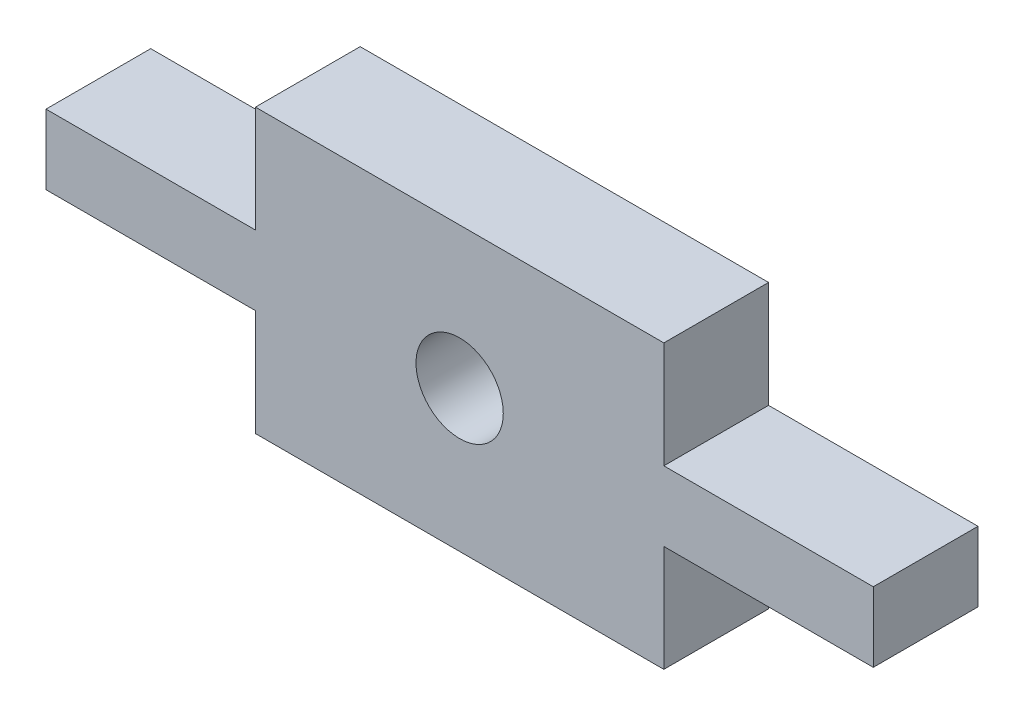
ISO-10303-21;
HEADER;
FILE_DESCRIPTION(('STEP AP214'),'2;1');
FILE_NAME('part.step','',(''),(''),'','','');
FILE_SCHEMA(('AUTOMOTIVE_DESIGN { 1 0 10303 214 1 1 1 1 }'));
ENDSEC;
DATA;
#1=APPLICATION_CONTEXT('core data for automotive mechanical design processes');
#2=APPLICATION_PROTOCOL_DEFINITION('international standard','automotive_design',2000,#1);
#3=PRODUCT_CONTEXT('',#1,'mechanical');
#4=PRODUCT('Part','Part','',(#3));
#5=PRODUCT_RELATED_PRODUCT_CATEGORY('part','',(#4));
#6=PRODUCT_DEFINITION_FORMATION('','',#4);
#7=PRODUCT_DEFINITION_CONTEXT('part definition',#1,'design');
#8=PRODUCT_DEFINITION('design','',#6,#7);
#9=PRODUCT_DEFINITION_SHAPE('','',#8);
#10=(LENGTH_UNIT() NAMED_UNIT(*) SI_UNIT(.MILLI.,.METRE.));
#11=(NAMED_UNIT(*) PLANE_ANGLE_UNIT() SI_UNIT($,.RADIAN.));
#12=(NAMED_UNIT(*) SI_UNIT($,.STERADIAN.) SOLID_ANGLE_UNIT());
#13=UNCERTAINTY_MEASURE_WITH_UNIT(LENGTH_MEASURE(1.E-05),#10,'distance_accuracy_value','');
#14=(GEOMETRIC_REPRESENTATION_CONTEXT(3) GLOBAL_UNCERTAINTY_ASSIGNED_CONTEXT((#13)) GLOBAL_UNIT_ASSIGNED_CONTEXT((#10,
#11,#12)) REPRESENTATION_CONTEXT('',''));
#15=CARTESIAN_POINT('',(0.,0.,0.));
#16=DIRECTION('',(0.,0.,1.));
#17=DIRECTION('',(1.,0.,0.));
#18=AXIS2_PLACEMENT_3D('',#15,#16,#17);
#19=CARTESIAN_POINT('',(0.,0.,3.));
#20=DIRECTION('',(0.,0.,-1.));
#21=DIRECTION('',(-1.,0.,0.));
#22=AXIS2_PLACEMENT_3D('',#19,#20,#21);
#23=PLANE('',#22);
#24=DIRECTION('',(1.,0.,0.));
#25=VECTOR('',#24,1.);
#26=CARTESIAN_POINT('',(-11.85,-1.,3.));
#27=LINE('',#26,#25);
#28=CARTESIAN_POINT('',(-11.85,-1.,3.));
#29=VERTEX_POINT('',#28);
#30=CARTESIAN_POINT('',(-5.85,-1.,3.));
#31=VERTEX_POINT('',#30);
#32=EDGE_CURVE('E176',#29,#31,#27,.T.);
#33=ORIENTED_EDGE('',*,*,#32,.T.);
#34=DIRECTION('',(0.,-1.,0.));
#35=VECTOR('',#34,1.);
#36=CARTESIAN_POINT('',(-5.85,-1.,3.));
#37=LINE('',#36,#35);
#38=CARTESIAN_POINT('',(-5.85,-4.05,3.));
#39=VERTEX_POINT('',#38);
#40=EDGE_CURVE('E104',#31,#39,#37,.T.);
#41=ORIENTED_EDGE('',*,*,#40,.T.);
#42=DIRECTION('',(1.,0.,0.));
#43=VECTOR('',#42,1.);
#44=CARTESIAN_POINT('',(-5.85,-4.05,3.));
#45=LINE('',#44,#43);
#46=CARTESIAN_POINT('',(5.85,-4.05,3.));
#47=VERTEX_POINT('',#46);
#48=EDGE_CURVE('E203',#39,#47,#45,.T.);
#49=ORIENTED_EDGE('',*,*,#48,.T.);
#50=DIRECTION('',(0.,1.,0.));
#51=VECTOR('',#50,1.);
#52=CARTESIAN_POINT('',(5.85,-4.05,3.));
#53=LINE('',#52,#51);
#54=CARTESIAN_POINT('',(5.85,-0.999999999999996,3.));
#55=VERTEX_POINT('',#54);
#56=EDGE_CURVE('E222',#47,#55,#53,.T.);
#57=ORIENTED_EDGE('',*,*,#56,.T.);
#58=DIRECTION('',(1.,0.,0.));
#59=VECTOR('',#58,1.);
#60=CARTESIAN_POINT('',(5.85,-0.999999999999996,3.));
#61=LINE('',#60,#59);
#62=CARTESIAN_POINT('',(11.85,-0.999999999999994,3.));
#63=VERTEX_POINT('',#62);
#64=EDGE_CURVE('E219',#55,#63,#61,.T.);
#65=ORIENTED_EDGE('',*,*,#64,.T.);
#66=DIRECTION('',(0.,1.,0.));
#67=VECTOR('',#66,1.);
#68=CARTESIAN_POINT('',(11.85,-0.999999999999994,3.));
#69=LINE('',#68,#67);
#70=CARTESIAN_POINT('',(11.85,1.00000000000001,3.));
#71=VERTEX_POINT('',#70);
#72=EDGE_CURVE('E221',#63,#71,#69,.T.);
#73=ORIENTED_EDGE('',*,*,#72,.T.);
#74=DIRECTION('',(-1.,0.,0.));
#75=VECTOR('',#74,1.);
#76=CARTESIAN_POINT('',(11.85,1.00000000000001,3.));
#77=LINE('',#76,#75);
#78=CARTESIAN_POINT('',(5.85,1.00000000000001,3.));
#79=VERTEX_POINT('',#78);
#80=EDGE_CURVE('E224',#71,#79,#77,.T.);
#81=ORIENTED_EDGE('',*,*,#80,.T.);
#82=DIRECTION('',(0.,1.,0.));
#83=VECTOR('',#82,1.);
#84=CARTESIAN_POINT('',(5.85,1.00000000000001,3.));
#85=LINE('',#84,#83);
#86=CARTESIAN_POINT('',(5.85,4.05000000000001,3.));
#87=VERTEX_POINT('',#86);
#88=EDGE_CURVE('E230',#79,#87,#85,.T.);
#89=ORIENTED_EDGE('',*,*,#88,.T.);
#90=DIRECTION('',(-1.,0.,0.));
#91=VECTOR('',#90,1.);
#92=CARTESIAN_POINT('',(5.85,4.05000000000001,3.));
#93=LINE('',#92,#91);
#94=CARTESIAN_POINT('',(-5.85,4.05,3.));
#95=VERTEX_POINT('',#94);
#96=EDGE_CURVE('E135',#87,#95,#93,.T.);
#97=ORIENTED_EDGE('',*,*,#96,.T.);
#98=DIRECTION('',(0.,-1.,0.));
#99=VECTOR('',#98,1.);
#100=CARTESIAN_POINT('',(-5.85,4.05,3.));
#101=LINE('',#100,#99);
#102=CARTESIAN_POINT('',(-5.85,0.999999999999998,3.));
#103=VERTEX_POINT('',#102);
#104=EDGE_CURVE('E129',#95,#103,#101,.T.);
#105=ORIENTED_EDGE('',*,*,#104,.T.);
#106=DIRECTION('',(-1.,0.,0.));
#107=VECTOR('',#106,1.);
#108=CARTESIAN_POINT('',(-5.85,0.999999999999998,3.));
#109=LINE('',#108,#107);
#110=CARTESIAN_POINT('',(-11.85,0.999999999999997,3.));
#111=VERTEX_POINT('',#110);
#112=EDGE_CURVE('E133',#103,#111,#109,.T.);
#113=ORIENTED_EDGE('',*,*,#112,.T.);
#114=DIRECTION('',(0.,-1.,0.));
#115=VECTOR('',#114,1.);
#116=CARTESIAN_POINT('',(-11.85,0.999999999999997,3.));
#117=LINE('',#116,#115);
#118=EDGE_CURVE('E49',#111,#29,#117,.T.);
#119=ORIENTED_EDGE('',*,*,#118,.T.);
#120=EDGE_LOOP('',(#33,#41,#49,#57,#65,#73,#81,#89,#97,#105,#113,#119));
#121=FACE_BOUND('',#120,.T.);
#122=CARTESIAN_POINT('',(0.,0.,3.));
#123=DIRECTION('',(0.,0.,1.));
#124=DIRECTION('',(1.,0.,0.));
#125=AXIS2_PLACEMENT_3D('',#122,#123,#124);
#126=CIRCLE('',#125,1.25);
#127=CARTESIAN_POINT('',(1.25,0.,3.));
#128=VERTEX_POINT('',#127);
#129=EDGE_CURVE('E157',#128,#128,#126,.T.);
#130=ORIENTED_EDGE('',*,*,#129,.F.);
#131=EDGE_LOOP('',(#130));
#132=FACE_BOUND('',#131,.T.);
#133=ADVANCED_FACE('F32',(#121,#132),#23,.F.);
#134=CARTESIAN_POINT('',(0.,0.,0.));
#135=DIRECTION('',(0.,0.,-1.));
#136=DIRECTION('',(-1.,0.,0.));
#137=AXIS2_PLACEMENT_3D('',#134,#135,#136);
#138=PLANE('',#137);
#139=DIRECTION('',(1.,0.,0.));
#140=VECTOR('',#139,1.);
#141=CARTESIAN_POINT('',(-11.85,-1.,0.));
#142=LINE('',#141,#140);
#143=CARTESIAN_POINT('',(-11.85,-1.,0.));
#144=VERTEX_POINT('',#143);
#145=CARTESIAN_POINT('',(-5.85,-1.,0.));
#146=VERTEX_POINT('',#145);
#147=EDGE_CURVE('E153',#144,#146,#142,.T.);
#148=ORIENTED_EDGE('',*,*,#147,.F.);
#149=DIRECTION('',(0.,-1.,0.));
#150=VECTOR('',#149,1.);
#151=CARTESIAN_POINT('',(-11.85,0.999999999999997,0.));
#152=LINE('',#151,#150);
#153=CARTESIAN_POINT('',(-11.85,0.999999999999997,0.));
#154=VERTEX_POINT('',#153);
#155=EDGE_CURVE('E96',#154,#144,#152,.T.);
#156=ORIENTED_EDGE('',*,*,#155,.F.);
#157=DIRECTION('',(-1.,0.,0.));
#158=VECTOR('',#157,1.);
#159=CARTESIAN_POINT('',(-5.85,0.999999999999998,0.));
#160=LINE('',#159,#158);
#161=CARTESIAN_POINT('',(-5.85,0.999999999999998,0.));
#162=VERTEX_POINT('',#161);
#163=EDGE_CURVE('E90',#162,#154,#160,.T.);
#164=ORIENTED_EDGE('',*,*,#163,.F.);
#165=DIRECTION('',(0.,-1.,0.));
#166=VECTOR('',#165,1.);
#167=CARTESIAN_POINT('',(-5.85,4.05,0.));
#168=LINE('',#167,#166);
#169=CARTESIAN_POINT('',(-5.85,4.05,0.));
#170=VERTEX_POINT('',#169);
#171=EDGE_CURVE('E143',#170,#162,#168,.T.);
#172=ORIENTED_EDGE('',*,*,#171,.F.);
#173=DIRECTION('',(-1.,0.,0.));
#174=VECTOR('',#173,1.);
#175=CARTESIAN_POINT('',(5.85,4.05000000000001,0.));
#176=LINE('',#175,#174);
#177=CARTESIAN_POINT('',(5.85,4.05000000000001,0.));
#178=VERTEX_POINT('',#177);
#179=EDGE_CURVE('E171',#178,#170,#176,.T.);
#180=ORIENTED_EDGE('',*,*,#179,.F.);
#181=DIRECTION('',(0.,1.,0.));
#182=VECTOR('',#181,1.);
#183=CARTESIAN_POINT('',(5.85,1.00000000000001,0.));
#184=LINE('',#183,#182);
#185=CARTESIAN_POINT('',(5.85,1.00000000000001,0.));
#186=VERTEX_POINT('',#185);
#187=EDGE_CURVE('E169',#186,#178,#184,.T.);
#188=ORIENTED_EDGE('',*,*,#187,.F.);
#189=DIRECTION('',(-1.,0.,0.));
#190=VECTOR('',#189,1.);
#191=CARTESIAN_POINT('',(11.85,1.00000000000001,0.));
#192=LINE('',#191,#190);
#193=CARTESIAN_POINT('',(11.85,1.00000000000001,0.));
#194=VERTEX_POINT('',#193);
#195=EDGE_CURVE('E167',#194,#186,#192,.T.);
#196=ORIENTED_EDGE('',*,*,#195,.F.);
#197=DIRECTION('',(0.,1.,0.));
#198=VECTOR('',#197,1.);
#199=CARTESIAN_POINT('',(11.85,-0.999999999999994,0.));
#200=LINE('',#199,#198);
#201=CARTESIAN_POINT('',(11.85,-0.999999999999994,0.));
#202=VERTEX_POINT('',#201);
#203=EDGE_CURVE('E165',#202,#194,#200,.T.);
#204=ORIENTED_EDGE('',*,*,#203,.F.);
#205=DIRECTION('',(1.,0.,0.));
#206=VECTOR('',#205,1.);
#207=CARTESIAN_POINT('',(5.85,-0.999999999999996,0.));
#208=LINE('',#207,#206);
#209=CARTESIAN_POINT('',(5.85,-0.999999999999996,0.));
#210=VERTEX_POINT('',#209);
#211=EDGE_CURVE('E163',#210,#202,#208,.T.);
#212=ORIENTED_EDGE('',*,*,#211,.F.);
#213=DIRECTION('',(0.,1.,0.));
#214=VECTOR('',#213,1.);
#215=CARTESIAN_POINT('',(5.85,-4.05,0.));
#216=LINE('',#215,#214);
#217=CARTESIAN_POINT('',(5.85,-4.05,0.));
#218=VERTEX_POINT('',#217);
#219=EDGE_CURVE('E161',#218,#210,#216,.T.);
#220=ORIENTED_EDGE('',*,*,#219,.F.);
#221=DIRECTION('',(1.,0.,0.));
#222=VECTOR('',#221,1.);
#223=CARTESIAN_POINT('',(-5.85,-4.05,0.));
#224=LINE('',#223,#222);
#225=CARTESIAN_POINT('',(-5.85,-4.05,0.));
#226=VERTEX_POINT('',#225);
#227=EDGE_CURVE('E159',#226,#218,#224,.T.);
#228=ORIENTED_EDGE('',*,*,#227,.F.);
#229=DIRECTION('',(0.,-1.,0.));
#230=VECTOR('',#229,1.);
#231=CARTESIAN_POINT('',(-5.85,-1.,0.));
#232=LINE('',#231,#230);
#233=EDGE_CURVE('E156',#146,#226,#232,.T.);
#234=ORIENTED_EDGE('',*,*,#233,.F.);
#235=EDGE_LOOP('',(#148,#156,#164,#172,#180,#188,#196,#204,#212,#220,#228,#234));
#236=FACE_BOUND('',#235,.T.);
#237=CARTESIAN_POINT('',(0.,0.,0.));
#238=DIRECTION('',(0.,0.,1.));
#239=DIRECTION('',(1.,0.,0.));
#240=AXIS2_PLACEMENT_3D('',#237,#238,#239);
#241=CIRCLE('',#240,1.25);
#242=CARTESIAN_POINT('',(1.25,0.,0.));
#243=VERTEX_POINT('',#242);
#244=EDGE_CURVE('E377',#243,#243,#241,.T.);
#245=ORIENTED_EDGE('',*,*,#244,.T.);
#246=EDGE_LOOP('',(#245));
#247=FACE_BOUND('',#246,.T.);
#248=ADVANCED_FACE('F207',(#236,#247),#138,.T.);
#249=CARTESIAN_POINT('',(-11.85,-1.,3.));
#250=DIRECTION('',(0.,1.,0.));
#251=DIRECTION('',(-1.,0.,0.));
#252=AXIS2_PLACEMENT_3D('',#249,#250,#251);
#253=PLANE('',#252);
#254=ORIENTED_EDGE('',*,*,#147,.T.);
#255=DIRECTION('',(0.,0.,-1.));
#256=VECTOR('',#255,1.);
#257=CARTESIAN_POINT('',(-5.85,-1.,3.));
#258=LINE('',#257,#256);
#259=EDGE_CURVE('E11',#31,#146,#258,.T.);
#260=ORIENTED_EDGE('',*,*,#259,.F.);
#261=ORIENTED_EDGE('',*,*,#32,.F.);
#262=DIRECTION('',(0.,0.,-1.));
#263=VECTOR('',#262,1.);
#264=CARTESIAN_POINT('',(-11.85,-1.,3.));
#265=LINE('',#264,#263);
#266=EDGE_CURVE('E149',#29,#144,#265,.T.);
#267=ORIENTED_EDGE('',*,*,#266,.T.);
#268=EDGE_LOOP('',(#254,#260,#261,#267));
#269=FACE_BOUND('',#268,.T.);
#270=ADVANCED_FACE('F34',(#269),#253,.F.);
#271=CARTESIAN_POINT('',(-5.85,-1.,3.));
#272=DIRECTION('',(1.,0.,0.));
#273=DIRECTION('',(0.,1.,0.));
#274=AXIS2_PLACEMENT_3D('',#271,#272,#273);
#275=PLANE('',#274);
#276=ORIENTED_EDGE('',*,*,#233,.T.);
#277=DIRECTION('',(0.,0.,-1.));
#278=VECTOR('',#277,1.);
#279=CARTESIAN_POINT('',(-5.85,-4.05,3.));
#280=LINE('',#279,#278);
#281=EDGE_CURVE('E41',#39,#226,#280,.T.);
#282=ORIENTED_EDGE('',*,*,#281,.F.);
#283=ORIENTED_EDGE('',*,*,#40,.F.);
#284=ORIENTED_EDGE('',*,*,#259,.T.);
#285=EDGE_LOOP('',(#276,#282,#283,#284));
#286=FACE_BOUND('',#285,.T.);
#287=ADVANCED_FACE('F264',(#286),#275,.F.);
#288=CARTESIAN_POINT('',(-5.85,-4.05,3.));
#289=DIRECTION('',(0.,1.,0.));
#290=DIRECTION('',(-1.,0.,0.));
#291=AXIS2_PLACEMENT_3D('',#288,#289,#290);
#292=PLANE('',#291);
#293=ORIENTED_EDGE('',*,*,#227,.T.);
#294=DIRECTION('',(0.,0.,-1.));
#295=VECTOR('',#294,1.);
#296=CARTESIAN_POINT('',(5.85,-4.05,3.));
#297=LINE('',#296,#295);
#298=EDGE_CURVE('E195',#47,#218,#297,.T.);
#299=ORIENTED_EDGE('',*,*,#298,.F.);
#300=ORIENTED_EDGE('',*,*,#48,.F.);
#301=ORIENTED_EDGE('',*,*,#281,.T.);
#302=EDGE_LOOP('',(#293,#299,#300,#301));
#303=FACE_BOUND('',#302,.T.);
#304=ADVANCED_FACE('F201',(#303),#292,.F.);
#305=CARTESIAN_POINT('',(5.85,-4.05,3.));
#306=DIRECTION('',(-1.,0.,0.));
#307=DIRECTION('',(0.,-1.,0.));
#308=AXIS2_PLACEMENT_3D('',#305,#306,#307);
#309=PLANE('',#308);
#310=ORIENTED_EDGE('',*,*,#219,.T.);
#311=DIRECTION('',(0.,0.,-1.));
#312=VECTOR('',#311,1.);
#313=CARTESIAN_POINT('',(5.85,-0.999999999999996,3.));
#314=LINE('',#313,#312);
#315=EDGE_CURVE('E192',#55,#210,#314,.T.);
#316=ORIENTED_EDGE('',*,*,#315,.F.);
#317=ORIENTED_EDGE('',*,*,#56,.F.);
#318=ORIENTED_EDGE('',*,*,#298,.T.);
#319=EDGE_LOOP('',(#310,#316,#317,#318));
#320=FACE_BOUND('',#319,.T.);
#321=ADVANCED_FACE('F213',(#320),#309,.F.);
#322=CARTESIAN_POINT('',(5.85,-0.999999999999996,3.));
#323=DIRECTION('',(0.,1.,0.));
#324=DIRECTION('',(-1.,0.,0.));
#325=AXIS2_PLACEMENT_3D('',#322,#323,#324);
#326=PLANE('',#325);
#327=ORIENTED_EDGE('',*,*,#211,.T.);
#328=DIRECTION('',(0.,0.,-1.));
#329=VECTOR('',#328,1.);
#330=CARTESIAN_POINT('',(11.85,-0.999999999999994,3.));
#331=LINE('',#330,#329);
#332=EDGE_CURVE('E189',#63,#202,#331,.T.);
#333=ORIENTED_EDGE('',*,*,#332,.F.);
#334=ORIENTED_EDGE('',*,*,#64,.F.);
#335=ORIENTED_EDGE('',*,*,#315,.T.);
#336=EDGE_LOOP('',(#327,#333,#334,#335));
#337=FACE_BOUND('',#336,.T.);
#338=ADVANCED_FACE('F217',(#337),#326,.F.);
#339=CARTESIAN_POINT('',(11.85,-0.999999999999994,3.));
#340=DIRECTION('',(-1.,0.,0.));
#341=DIRECTION('',(0.,-1.,0.));
#342=AXIS2_PLACEMENT_3D('',#339,#340,#341);
#343=PLANE('',#342);
#344=ORIENTED_EDGE('',*,*,#203,.T.);
#345=DIRECTION('',(0.,0.,-1.));
#346=VECTOR('',#345,1.);
#347=CARTESIAN_POINT('',(11.85,1.00000000000001,3.));
#348=LINE('',#347,#346);
#349=EDGE_CURVE('E186',#71,#194,#348,.T.);
#350=ORIENTED_EDGE('',*,*,#349,.F.);
#351=ORIENTED_EDGE('',*,*,#72,.F.);
#352=ORIENTED_EDGE('',*,*,#332,.T.);
#353=EDGE_LOOP('',(#344,#350,#351,#352));
#354=FACE_BOUND('',#353,.T.);
#355=ADVANCED_FACE('F277',(#354),#343,.F.);
#356=CARTESIAN_POINT('',(11.85,1.00000000000001,3.));
#357=DIRECTION('',(0.,-1.,0.));
#358=DIRECTION('',(0.,0.,-1.));
#359=AXIS2_PLACEMENT_3D('',#356,#357,#358);
#360=PLANE('',#359);
#361=ORIENTED_EDGE('',*,*,#195,.T.);
#362=DIRECTION('',(0.,0.,-1.));
#363=VECTOR('',#362,1.);
#364=CARTESIAN_POINT('',(5.85,1.00000000000001,3.));
#365=LINE('',#364,#363);
#366=EDGE_CURVE('E183',#79,#186,#365,.T.);
#367=ORIENTED_EDGE('',*,*,#366,.F.);
#368=ORIENTED_EDGE('',*,*,#80,.F.);
#369=ORIENTED_EDGE('',*,*,#349,.T.);
#370=EDGE_LOOP('',(#361,#367,#368,#369));
#371=FACE_BOUND('',#370,.T.);
#372=ADVANCED_FACE('F280',(#371),#360,.F.);
#373=CARTESIAN_POINT('',(5.85,1.00000000000001,3.));
#374=DIRECTION('',(-1.,0.,0.));
#375=DIRECTION('',(0.,0.,1.));
#376=AXIS2_PLACEMENT_3D('',#373,#374,#375);
#377=PLANE('',#376);
#378=ORIENTED_EDGE('',*,*,#187,.T.);
#379=DIRECTION('',(0.,0.,-1.));
#380=VECTOR('',#379,1.);
#381=CARTESIAN_POINT('',(5.85,4.05000000000001,3.));
#382=LINE('',#381,#380);
#383=EDGE_CURVE('E180',#87,#178,#382,.T.);
#384=ORIENTED_EDGE('',*,*,#383,.F.);
#385=ORIENTED_EDGE('',*,*,#88,.F.);
#386=ORIENTED_EDGE('',*,*,#366,.T.);
#387=EDGE_LOOP('',(#378,#384,#385,#386));
#388=FACE_BOUND('',#387,.T.);
#389=ADVANCED_FACE('F236',(#388),#377,.F.);
#390=CARTESIAN_POINT('',(5.85,4.05000000000001,3.));
#391=DIRECTION('',(0.,-1.,0.));
#392=DIRECTION('',(1.,0.,0.));
#393=AXIS2_PLACEMENT_3D('',#390,#391,#392);
#394=PLANE('',#393);
#395=ORIENTED_EDGE('',*,*,#179,.T.);
#396=DIRECTION('',(0.,0.,-1.));
#397=VECTOR('',#396,1.);
#398=CARTESIAN_POINT('',(-5.85,4.05,3.));
#399=LINE('',#398,#397);
#400=EDGE_CURVE('E144',#95,#170,#399,.T.);
#401=ORIENTED_EDGE('',*,*,#400,.F.);
#402=ORIENTED_EDGE('',*,*,#96,.F.);
#403=ORIENTED_EDGE('',*,*,#383,.T.);
#404=EDGE_LOOP('',(#395,#401,#402,#403));
#405=FACE_BOUND('',#404,.T.);
#406=ADVANCED_FACE('F240',(#405),#394,.F.);
#407=CARTESIAN_POINT('',(-5.85,4.05,3.));
#408=DIRECTION('',(1.,0.,0.));
#409=DIRECTION('',(0.,1.,0.));
#410=AXIS2_PLACEMENT_3D('',#407,#408,#409);
#411=PLANE('',#410);
#412=ORIENTED_EDGE('',*,*,#171,.T.);
#413=DIRECTION('',(0.,0.,-1.));
#414=VECTOR('',#413,1.);
#415=CARTESIAN_POINT('',(-5.85,0.999999999999998,3.));
#416=LINE('',#415,#414);
#417=EDGE_CURVE('E140',#103,#162,#416,.T.);
#418=ORIENTED_EDGE('',*,*,#417,.F.);
#419=ORIENTED_EDGE('',*,*,#104,.F.);
#420=ORIENTED_EDGE('',*,*,#400,.T.);
#421=EDGE_LOOP('',(#412,#418,#419,#420));
#422=FACE_BOUND('',#421,.T.);
#423=ADVANCED_FACE('F141',(#422),#411,.F.);
#424=CARTESIAN_POINT('',(-5.85,0.999999999999998,3.));
#425=DIRECTION('',(0.,-1.,0.));
#426=DIRECTION('',(1.,0.,0.));
#427=AXIS2_PLACEMENT_3D('',#424,#425,#426);
#428=PLANE('',#427);
#429=ORIENTED_EDGE('',*,*,#163,.T.);
#430=DIRECTION('',(0.,0.,-1.));
#431=VECTOR('',#430,1.);
#432=CARTESIAN_POINT('',(-11.85,0.999999999999997,3.));
#433=LINE('',#432,#431);
#434=EDGE_CURVE('E145',#111,#154,#433,.T.);
#435=ORIENTED_EDGE('',*,*,#434,.F.);
#436=ORIENTED_EDGE('',*,*,#112,.F.);
#437=ORIENTED_EDGE('',*,*,#417,.T.);
#438=EDGE_LOOP('',(#429,#435,#436,#437));
#439=FACE_BOUND('',#438,.T.);
#440=ADVANCED_FACE('F147',(#439),#428,.F.);
#441=CARTESIAN_POINT('',(-11.85,0.999999999999997,3.));
#442=DIRECTION('',(1.,0.,0.));
#443=DIRECTION('',(0.,1.,0.));
#444=AXIS2_PLACEMENT_3D('',#441,#442,#443);
#445=PLANE('',#444);
#446=ORIENTED_EDGE('',*,*,#155,.T.);
#447=ORIENTED_EDGE('',*,*,#266,.F.);
#448=ORIENTED_EDGE('',*,*,#118,.F.);
#449=ORIENTED_EDGE('',*,*,#434,.T.);
#450=EDGE_LOOP('',(#446,#447,#448,#449));
#451=FACE_BOUND('',#450,.T.);
#452=ADVANCED_FACE('F244',(#451),#445,.F.);
#453=CARTESIAN_POINT('',(0.,0.,3.));
#454=DIRECTION('',(0.,0.,-1.));
#455=DIRECTION('',(-1.,0.,0.));
#456=AXIS2_PLACEMENT_3D('',#453,#454,#455);
#457=CYLINDRICAL_SURFACE('',#456,1.25);
#458=ORIENTED_EDGE('',*,*,#129,.T.);
#459=EDGE_LOOP('',(#458));
#460=FACE_BOUND('',#459,.T.);
#461=ORIENTED_EDGE('',*,*,#244,.F.);
#462=EDGE_LOOP('',(#461));
#463=FACE_BOUND('',#462,.T.);
#464=ADVANCED_FACE('F246',(#460,#463),#457,.F.);
#465=CLOSED_SHELL('',(#133,#248,#270,#287,#304,#321,#338,#355,#372,#389,#406,#423,#440,#452,#464));
#466=MANIFOLD_SOLID_BREP('B2',#465);
#467=ADVANCED_BREP_SHAPE_REPRESENTATION('',(#18,#466),#14);
#468=SHAPE_DEFINITION_REPRESENTATION(#9,#467);
ENDSEC;
END-ISO-10303-21;
